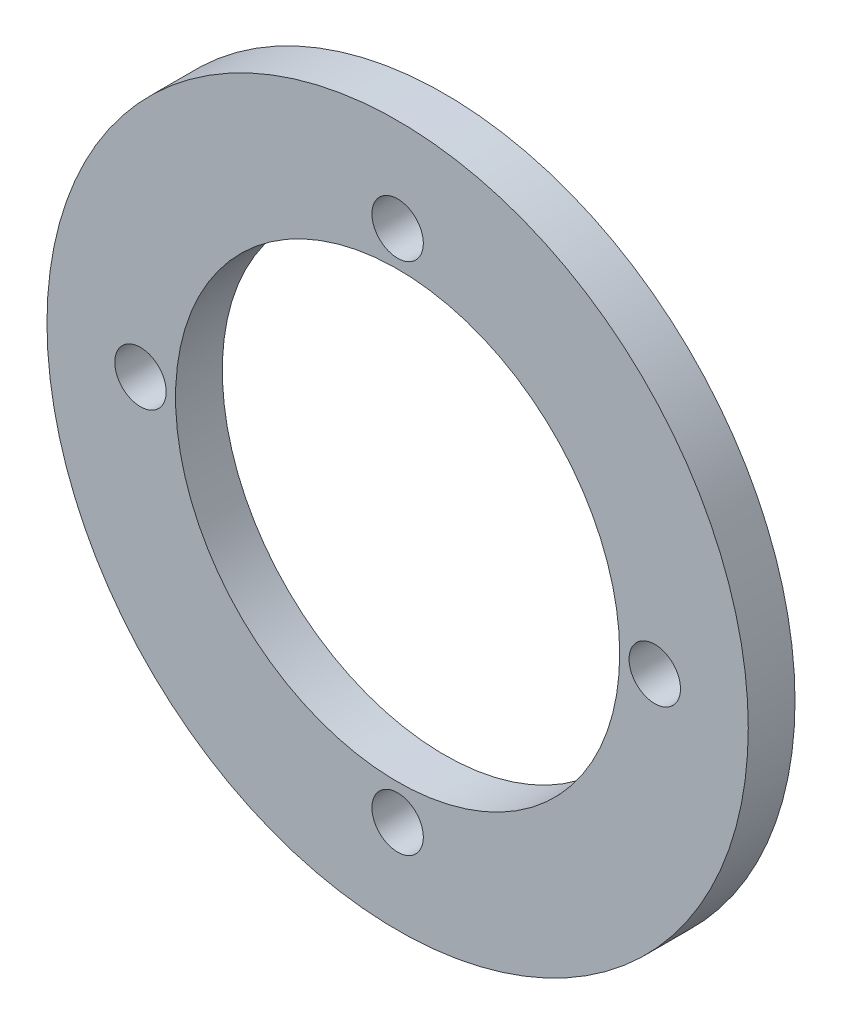
ISO-10303-21;
HEADER;
FILE_DESCRIPTION(('STEP AP214'),'2;1');
FILE_NAME('part.step','',(''),(''),'','','');
FILE_SCHEMA(('AUTOMOTIVE_DESIGN { 1 0 10303 214 1 1 1 1 }'));
ENDSEC;
DATA;
#1=APPLICATION_CONTEXT('core data for automotive mechanical design processes');
#2=APPLICATION_PROTOCOL_DEFINITION('international standard','automotive_design',2000,#1);
#3=PRODUCT_CONTEXT('',#1,'mechanical');
#4=PRODUCT('Part','Part','',(#3));
#5=PRODUCT_RELATED_PRODUCT_CATEGORY('part','',(#4));
#6=PRODUCT_DEFINITION_FORMATION('','',#4);
#7=PRODUCT_DEFINITION_CONTEXT('part definition',#1,'design');
#8=PRODUCT_DEFINITION('design','',#6,#7);
#9=PRODUCT_DEFINITION_SHAPE('','',#8);
#10=(LENGTH_UNIT() NAMED_UNIT(*) SI_UNIT(.MILLI.,.METRE.));
#11=(NAMED_UNIT(*) PLANE_ANGLE_UNIT() SI_UNIT($,.RADIAN.));
#12=(NAMED_UNIT(*) SI_UNIT($,.STERADIAN.) SOLID_ANGLE_UNIT());
#13=UNCERTAINTY_MEASURE_WITH_UNIT(LENGTH_MEASURE(1.E-05),#10,'distance_accuracy_value','');
#14=(GEOMETRIC_REPRESENTATION_CONTEXT(3) GLOBAL_UNCERTAINTY_ASSIGNED_CONTEXT((#13)) GLOBAL_UNIT_ASSIGNED_CONTEXT((#10,
#11,#12)) REPRESENTATION_CONTEXT('',''));
#15=CARTESIAN_POINT('',(0.,0.,0.));
#16=DIRECTION('',(0.,0.,1.));
#17=DIRECTION('',(1.,0.,0.));
#18=AXIS2_PLACEMENT_3D('',#15,#16,#17);
#19=CARTESIAN_POINT('',(0.,0.,2.));
#20=DIRECTION('',(0.,0.,1.));
#21=DIRECTION('',(1.,0.,0.));
#22=AXIS2_PLACEMENT_3D('',#19,#20,#21);
#23=PLANE('',#22);
#24=CARTESIAN_POINT('',(0.,11.,2.));
#25=DIRECTION('',(0.,0.,1.));
#26=DIRECTION('',(1.,0.,0.));
#27=AXIS2_PLACEMENT_3D('',#24,#25,#26);
#28=CIRCLE('',#27,1.1);
#29=CARTESIAN_POINT('',(1.1,11.,2.));
#30=VERTEX_POINT('',#29);
#31=EDGE_CURVE('E70',#30,#30,#28,.T.);
#32=ORIENTED_EDGE('',*,*,#31,.F.);
#33=EDGE_LOOP('',(#32));
#34=FACE_BOUND('',#33,.T.);
#35=CARTESIAN_POINT('',(11.,0.,2.));
#36=DIRECTION('',(0.,0.,1.));
#37=DIRECTION('',(1.,0.,0.));
#38=AXIS2_PLACEMENT_3D('',#35,#36,#37);
#39=CIRCLE('',#38,1.1);
#40=CARTESIAN_POINT('',(12.1,0.,2.));
#41=VERTEX_POINT('',#40);
#42=EDGE_CURVE('E64',#41,#41,#39,.T.);
#43=ORIENTED_EDGE('',*,*,#42,.F.);
#44=EDGE_LOOP('',(#43));
#45=FACE_BOUND('',#44,.T.);
#46=CARTESIAN_POINT('',(0.,-11.,2.));
#47=DIRECTION('',(0.,0.,1.));
#48=DIRECTION('',(1.,0.,0.));
#49=AXIS2_PLACEMENT_3D('',#46,#47,#48);
#50=CIRCLE('',#49,1.1);
#51=CARTESIAN_POINT('',(1.1,-11.,2.));
#52=VERTEX_POINT('',#51);
#53=EDGE_CURVE('E58',#52,#52,#50,.T.);
#54=ORIENTED_EDGE('',*,*,#53,.F.);
#55=EDGE_LOOP('',(#54));
#56=FACE_BOUND('',#55,.T.);
#57=CARTESIAN_POINT('',(-11.,0.,2.));
#58=DIRECTION('',(0.,0.,1.));
#59=DIRECTION('',(1.,0.,0.));
#60=AXIS2_PLACEMENT_3D('',#57,#58,#59);
#61=CIRCLE('',#60,1.1);
#62=CARTESIAN_POINT('',(-9.9,0.,2.));
#63=VERTEX_POINT('',#62);
#64=EDGE_CURVE('E52',#63,#63,#61,.T.);
#65=ORIENTED_EDGE('',*,*,#64,.F.);
#66=EDGE_LOOP('',(#65));
#67=FACE_BOUND('',#66,.T.);
#68=CARTESIAN_POINT('',(0.,0.,2.));
#69=DIRECTION('',(0.,0.,1.));
#70=DIRECTION('',(1.,0.,0.));
#71=AXIS2_PLACEMENT_3D('',#68,#69,#70);
#72=CIRCLE('',#71,15.);
#73=CARTESIAN_POINT('',(15.,0.,2.));
#74=VERTEX_POINT('',#73);
#75=EDGE_CURVE('E10',#74,#74,#72,.T.);
#76=ORIENTED_EDGE('',*,*,#75,.T.);
#77=EDGE_LOOP('',(#76));
#78=FACE_BOUND('',#77,.T.);
#79=CARTESIAN_POINT('',(0.,0.,2.));
#80=DIRECTION('',(0.,0.,1.));
#81=DIRECTION('',(1.,0.,0.));
#82=AXIS2_PLACEMENT_3D('',#79,#80,#81);
#83=CIRCLE('',#82,9.5);
#84=CARTESIAN_POINT('',(9.5,0.,2.));
#85=VERTEX_POINT('',#84);
#86=EDGE_CURVE('E44',#85,#85,#83,.T.);
#87=ORIENTED_EDGE('',*,*,#86,.F.);
#88=EDGE_LOOP('',(#87));
#89=FACE_BOUND('',#88,.T.);
#90=ADVANCED_FACE('F33',(#34,#45,#56,#67,#78,#89),#23,.T.);
#91=CARTESIAN_POINT('',(0.,0.,0.));
#92=DIRECTION('',(0.,0.,1.));
#93=DIRECTION('',(1.,0.,0.));
#94=AXIS2_PLACEMENT_3D('',#91,#92,#93);
#95=PLANE('',#94);
#96=CARTESIAN_POINT('',(0.,11.,0.));
#97=DIRECTION('',(0.,0.,1.));
#98=DIRECTION('',(1.,0.,0.));
#99=AXIS2_PLACEMENT_3D('',#96,#97,#98);
#100=CIRCLE('',#99,1.1);
#101=CARTESIAN_POINT('',(1.1,11.,0.));
#102=VERTEX_POINT('',#101);
#103=EDGE_CURVE('E49',#102,#102,#100,.T.);
#104=ORIENTED_EDGE('',*,*,#103,.T.);
#105=EDGE_LOOP('',(#104));
#106=FACE_BOUND('',#105,.T.);
#107=CARTESIAN_POINT('',(11.,0.,0.));
#108=DIRECTION('',(0.,0.,1.));
#109=DIRECTION('',(1.,0.,0.));
#110=AXIS2_PLACEMENT_3D('',#107,#108,#109);
#111=CIRCLE('',#110,1.1);
#112=CARTESIAN_POINT('',(12.1,0.,0.));
#113=VERTEX_POINT('',#112);
#114=EDGE_CURVE('E67',#113,#113,#111,.T.);
#115=ORIENTED_EDGE('',*,*,#114,.T.);
#116=EDGE_LOOP('',(#115));
#117=FACE_BOUND('',#116,.T.);
#118=CARTESIAN_POINT('',(0.,-11.,0.));
#119=DIRECTION('',(0.,0.,1.));
#120=DIRECTION('',(1.,0.,0.));
#121=AXIS2_PLACEMENT_3D('',#118,#119,#120);
#122=CIRCLE('',#121,1.1);
#123=CARTESIAN_POINT('',(1.1,-11.,0.));
#124=VERTEX_POINT('',#123);
#125=EDGE_CURVE('E61',#124,#124,#122,.T.);
#126=ORIENTED_EDGE('',*,*,#125,.T.);
#127=EDGE_LOOP('',(#126));
#128=FACE_BOUND('',#127,.T.);
#129=CARTESIAN_POINT('',(-11.,0.,0.));
#130=DIRECTION('',(0.,0.,1.));
#131=DIRECTION('',(1.,0.,0.));
#132=AXIS2_PLACEMENT_3D('',#129,#130,#131);
#133=CIRCLE('',#132,1.1);
#134=CARTESIAN_POINT('',(-9.9,0.,0.));
#135=VERTEX_POINT('',#134);
#136=EDGE_CURVE('E55',#135,#135,#133,.T.);
#137=ORIENTED_EDGE('',*,*,#136,.T.);
#138=EDGE_LOOP('',(#137));
#139=FACE_BOUND('',#138,.T.);
#140=CARTESIAN_POINT('',(0.,0.,0.));
#141=DIRECTION('',(0.,0.,1.));
#142=DIRECTION('',(1.,0.,0.));
#143=AXIS2_PLACEMENT_3D('',#140,#141,#142);
#144=CIRCLE('',#143,15.);
#145=CARTESIAN_POINT('',(15.,0.,0.));
#146=VERTEX_POINT('',#145);
#147=EDGE_CURVE('E37',#146,#146,#144,.T.);
#148=ORIENTED_EDGE('',*,*,#147,.F.);
#149=EDGE_LOOP('',(#148));
#150=FACE_BOUND('',#149,.T.);
#151=CARTESIAN_POINT('',(0.,0.,0.));
#152=DIRECTION('',(0.,0.,1.));
#153=DIRECTION('',(1.,0.,0.));
#154=AXIS2_PLACEMENT_3D('',#151,#152,#153);
#155=CIRCLE('',#154,9.5);
#156=CARTESIAN_POINT('',(9.5,0.,0.));
#157=VERTEX_POINT('',#156);
#158=EDGE_CURVE('E46',#157,#157,#155,.T.);
#159=ORIENTED_EDGE('',*,*,#158,.T.);
#160=EDGE_LOOP('',(#159));
#161=FACE_BOUND('',#160,.T.);
#162=ADVANCED_FACE('F76',(#106,#117,#128,#139,#150,#161),#95,.F.);
#163=CARTESIAN_POINT('',(0.,0.,2.));
#164=DIRECTION('',(0.,0.,-1.));
#165=DIRECTION('',(-1.,0.,0.));
#166=AXIS2_PLACEMENT_3D('',#163,#164,#165);
#167=CYLINDRICAL_SURFACE('',#166,15.);
#168=ORIENTED_EDGE('',*,*,#75,.F.);
#169=EDGE_LOOP('',(#168));
#170=FACE_BOUND('',#169,.T.);
#171=ORIENTED_EDGE('',*,*,#147,.T.);
#172=EDGE_LOOP('',(#171));
#173=FACE_BOUND('',#172,.T.);
#174=ADVANCED_FACE('F35',(#170,#173),#167,.T.);
#175=CARTESIAN_POINT('',(0.,0.,2.));
#176=DIRECTION('',(0.,0.,-1.));
#177=DIRECTION('',(-1.,0.,0.));
#178=AXIS2_PLACEMENT_3D('',#175,#176,#177);
#179=CYLINDRICAL_SURFACE('',#178,9.5);
#180=ORIENTED_EDGE('',*,*,#86,.T.);
#181=EDGE_LOOP('',(#180));
#182=FACE_BOUND('',#181,.T.);
#183=ORIENTED_EDGE('',*,*,#158,.F.);
#184=EDGE_LOOP('',(#183));
#185=FACE_BOUND('',#184,.T.);
#186=ADVANCED_FACE('F97',(#182,#185),#179,.F.);
#187=CARTESIAN_POINT('',(-11.,0.,0.));
#188=DIRECTION('',(0.,0.,1.));
#189=DIRECTION('',(1.,0.,0.));
#190=AXIS2_PLACEMENT_3D('',#187,#188,#189);
#191=CYLINDRICAL_SURFACE('',#190,1.1);
#192=ORIENTED_EDGE('',*,*,#136,.F.);
#193=EDGE_LOOP('',(#192));
#194=FACE_BOUND('',#193,.T.);
#195=ORIENTED_EDGE('',*,*,#64,.T.);
#196=EDGE_LOOP('',(#195));
#197=FACE_BOUND('',#196,.T.);
#198=ADVANCED_FACE('F100',(#194,#197),#191,.F.);
#199=CARTESIAN_POINT('',(0.,-11.,0.));
#200=DIRECTION('',(0.,0.,1.));
#201=DIRECTION('',(1.,0.,0.));
#202=AXIS2_PLACEMENT_3D('',#199,#200,#201);
#203=CYLINDRICAL_SURFACE('',#202,1.1);
#204=ORIENTED_EDGE('',*,*,#125,.F.);
#205=EDGE_LOOP('',(#204));
#206=FACE_BOUND('',#205,.T.);
#207=ORIENTED_EDGE('',*,*,#53,.T.);
#208=EDGE_LOOP('',(#207));
#209=FACE_BOUND('',#208,.T.);
#210=ADVANCED_FACE('F112',(#206,#209),#203,.F.);
#211=CARTESIAN_POINT('',(11.,0.,0.));
#212=DIRECTION('',(0.,0.,1.));
#213=DIRECTION('',(1.,0.,0.));
#214=AXIS2_PLACEMENT_3D('',#211,#212,#213);
#215=CYLINDRICAL_SURFACE('',#214,1.1);
#216=ORIENTED_EDGE('',*,*,#114,.F.);
#217=EDGE_LOOP('',(#216));
#218=FACE_BOUND('',#217,.T.);
#219=ORIENTED_EDGE('',*,*,#42,.T.);
#220=EDGE_LOOP('',(#219));
#221=FACE_BOUND('',#220,.T.);
#222=ADVANCED_FACE('F82',(#218,#221),#215,.F.);
#223=CARTESIAN_POINT('',(0.,11.,0.));
#224=DIRECTION('',(0.,0.,1.));
#225=DIRECTION('',(1.,0.,0.));
#226=AXIS2_PLACEMENT_3D('',#223,#224,#225);
#227=CYLINDRICAL_SURFACE('',#226,1.1);
#228=ORIENTED_EDGE('',*,*,#103,.F.);
#229=EDGE_LOOP('',(#228));
#230=FACE_BOUND('',#229,.T.);
#231=ORIENTED_EDGE('',*,*,#31,.T.);
#232=EDGE_LOOP('',(#231));
#233=FACE_BOUND('',#232,.T.);
#234=ADVANCED_FACE('F79',(#230,#233),#227,.F.);
#235=CLOSED_SHELL('',(#90,#162,#174,#186,#198,#210,#222,#234));
#236=MANIFOLD_SOLID_BREP('B2',#235);
#237=ADVANCED_BREP_SHAPE_REPRESENTATION('',(#18,#236),#14);
#238=SHAPE_DEFINITION_REPRESENTATION(#9,#237);
ENDSEC;
END-ISO-10303-21;
